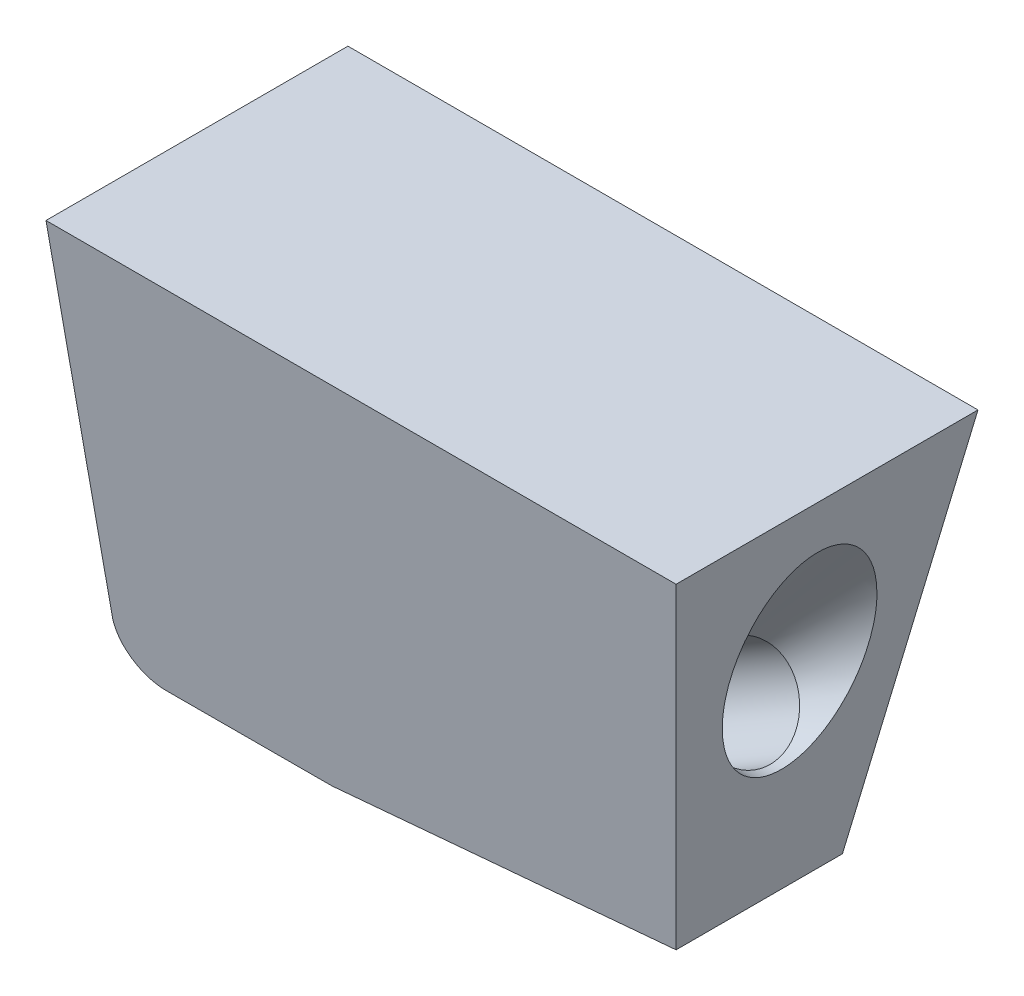
ISO-10303-21;
HEADER;
FILE_DESCRIPTION(('STEP AP214'),'2;1');
FILE_NAME('part.step','',(''),(''),'','','');
FILE_SCHEMA(('AUTOMOTIVE_DESIGN { 1 0 10303 214 1 1 1 1 }'));
ENDSEC;
DATA;
#1=APPLICATION_CONTEXT('core data for automotive mechanical design processes');
#2=APPLICATION_PROTOCOL_DEFINITION('international standard','automotive_design',2000,#1);
#3=PRODUCT_CONTEXT('',#1,'mechanical');
#4=PRODUCT('Part','Part','',(#3));
#5=PRODUCT_RELATED_PRODUCT_CATEGORY('part','',(#4));
#6=PRODUCT_DEFINITION_FORMATION('','',#4);
#7=PRODUCT_DEFINITION_CONTEXT('part definition',#1,'design');
#8=PRODUCT_DEFINITION('design','',#6,#7);
#9=PRODUCT_DEFINITION_SHAPE('','',#8);
#10=(LENGTH_UNIT() NAMED_UNIT(*) SI_UNIT(.MILLI.,.METRE.));
#11=(NAMED_UNIT(*) PLANE_ANGLE_UNIT() SI_UNIT($,.RADIAN.));
#12=(NAMED_UNIT(*) SI_UNIT($,.STERADIAN.) SOLID_ANGLE_UNIT());
#13=UNCERTAINTY_MEASURE_WITH_UNIT(LENGTH_MEASURE(1.E-05),#10,'distance_accuracy_value','');
#14=(GEOMETRIC_REPRESENTATION_CONTEXT(3) GLOBAL_UNCERTAINTY_ASSIGNED_CONTEXT((#13)) GLOBAL_UNIT_ASSIGNED_CONTEXT((#10,
#11,#12)) REPRESENTATION_CONTEXT('',''));
#15=CARTESIAN_POINT('',(0.,0.,0.));
#16=DIRECTION('',(0.,0.,1.));
#17=DIRECTION('',(1.,0.,0.));
#18=AXIS2_PLACEMENT_3D('',#15,#16,#17);
#19=CARTESIAN_POINT('',(38.0505893023531,0.,0.0508));
#20=DIRECTION('',(0.,-0.173648177666931,0.984807753012208));
#21=DIRECTION('',(0.,-0.984807753012208,-0.173648177666931));
#22=AXIS2_PLACEMENT_3D('',#19,#20,#21);
#23=PLANE('',#22);
#24=DIRECTION('',(-0.171087869746036,-0.970287525247814,-0.171087869746036));
#25=VECTOR('',#24,1.);
#26=CARTESIAN_POINT('',(1.10638409655466,6.31783117977007,1.16480409655466));
#27=LINE('',#26,#25);
#28=CARTESIAN_POINT('',(0.0416151661605582,0.279226502732242,0.100035166160561));
#29=VERTEX_POINT('',#28);
#30=CARTESIAN_POINT('',(-0.00330342407018095,0.0244805185938037,0.0551165759298227));
#31=VERTEX_POINT('',#30);
#32=EDGE_CURVE('E484',#29,#31,#27,.T.);
#33=ORIENTED_EDGE('',*,*,#32,.F.);
#34=DIRECTION('',(-1.,0.,0.));
#35=VECTOR('',#34,1.);
#36=CARTESIAN_POINT('',(38.0505893023531,0.27922650273224,0.10003516616056));
#37=LINE('',#36,#35);
#38=CARTESIAN_POINT('',(-0.37592,0.279226502732242,0.100035166160561));
#39=VERTEX_POINT('',#38);
#40=EDGE_CURVE('E76',#29,#39,#37,.T.);
#41=ORIENTED_EDGE('',*,*,#40,.T.);
#42=DIRECTION('',(0.,0.984807753012208,0.173648177666931));
#43=VECTOR('',#42,1.);
#44=CARTESIAN_POINT('',(-0.37592,28.949469786949,5.15537260064367));
#45=LINE('',#44,#43);
#46=CARTESIAN_POINT('',(-0.37592,0.0279933931874865,0.0557359905005352));
#47=VERTEX_POINT('',#46);
#48=EDGE_CURVE('E235',#47,#39,#45,.T.);
#49=ORIENTED_EDGE('',*,*,#48,.F.);
#50=CARTESIAN_POINT('',(-0.3455416,0.03048,0.0561744463719871));
#51=DIRECTION('',(0.,-0.173648177666931,0.984807753012208));
#52=DIRECTION('',(0.,-0.984807753012208,-0.173648177666931));
#53=AXIS2_PLACEMENT_3D('',#50,#51,#52);
#54=ELLIPSE('',#53,0.0309502031302775,0.03048);
#55=CARTESIAN_POINT('',(-0.345541599999999,0.,0.0508));
#56=VERTEX_POINT('',#55);
#57=EDGE_CURVE('E519',#56,#47,#54,.F.);
#58=ORIENTED_EDGE('',*,*,#57,.F.);
#59=DIRECTION('',(-1.,0.,0.));
#60=VECTOR('',#59,1.);
#61=CARTESIAN_POINT('',(38.0505893023531,0.,0.0508));
#62=LINE('',#61,#60);
#63=CARTESIAN_POINT('',(-0.235781197496023,4.61200016131661E-05,0.0506304480857589));
#64=VERTEX_POINT('',#63);
#65=EDGE_CURVE('E489',#64,#56,#62,.T.);
#66=ORIENTED_EDGE('',*,*,#65,.F.);
#67=DIRECTION('',(-0.994353014523129,-0.104510713175574,-0.0184280585059375));
#68=VECTOR('',#67,1.);
#69=CARTESIAN_POINT('',(37.6194000969927,3.97878600080242,0.752367322406603));
#70=LINE('',#69,#68);
#71=EDGE_CURVE('E492',#31,#64,#70,.T.);
#72=ORIENTED_EDGE('',*,*,#71,.F.);
#73=EDGE_LOOP('',(#33,#41,#49,#58,#66,#72));
#74=FACE_BOUND('',#73,.T.);
#75=ADVANCED_FACE('F47',(#74),#23,.T.);
#76=CARTESIAN_POINT('',(38.0505893023531,0.,-0.0508));
#77=DIRECTION('',(0.,-0.173648177666931,-0.984807753012208));
#78=DIRECTION('',(0.,0.984807753012208,-0.173648177666931));
#79=AXIS2_PLACEMENT_3D('',#76,#77,#78);
#80=PLANE('',#79);
#81=DIRECTION('',(0.,-0.984807753012208,0.173648177666931));
#82=VECTOR('',#81,1.);
#83=CARTESIAN_POINT('',(-0.37592,29.2239341047245,-5.20376806510924));
#84=LINE('',#83,#82);
#85=CARTESIAN_POINT('',(-0.37592,0.279226502732242,-0.10003516616056));
#86=VERTEX_POINT('',#85);
#87=CARTESIAN_POINT('',(-0.37592,0.0279933931874934,-0.0557359905005361));
#88=VERTEX_POINT('',#87);
#89=EDGE_CURVE('E55',#86,#88,#84,.T.);
#90=ORIENTED_EDGE('',*,*,#89,.F.);
#91=DIRECTION('',(1.,0.,0.));
#92=VECTOR('',#91,1.);
#93=CARTESIAN_POINT('',(38.0505893023531,0.27922650273224,-0.10003516616056));
#94=LINE('',#93,#92);
#95=CARTESIAN_POINT('',(0.0416151661605583,0.279226502732242,-0.100035166160562));
#96=VERTEX_POINT('',#95);
#97=EDGE_CURVE('E184',#86,#96,#94,.T.);
#98=ORIENTED_EDGE('',*,*,#97,.T.);
#99=DIRECTION('',(0.171087869746036,0.970287525247814,-0.171087869746036));
#100=VECTOR('',#99,1.);
#101=CARTESIAN_POINT('',(1.10638409655466,6.31783117977007,-1.16480409655466));
#102=LINE('',#101,#100);
#103=CARTESIAN_POINT('',(-0.00330342407018095,0.0244805185938037,-0.0551165759298227));
#104=VERTEX_POINT('',#103);
#105=EDGE_CURVE('E173',#104,#96,#102,.T.);
#106=ORIENTED_EDGE('',*,*,#105,.F.);
#107=DIRECTION('',(0.994353014523129,0.104510713175574,-0.0184280585059375));
#108=VECTOR('',#107,1.);
#109=CARTESIAN_POINT('',(37.6194000969927,3.97878600080242,-0.752367322406603));
#110=LINE('',#109,#108);
#111=CARTESIAN_POINT('',(-0.235926593045333,0.000106493973270587,-0.0503307727094258));
#112=VERTEX_POINT('',#111);
#113=EDGE_CURVE('E181',#112,#104,#110,.T.);
#114=ORIENTED_EDGE('',*,*,#113,.F.);
#115=DIRECTION('',(-1.,0.,0.));
#116=VECTOR('',#115,1.);
#117=CARTESIAN_POINT('',(38.0505893023531,0.,-0.0508));
#118=LINE('',#117,#116);
#119=CARTESIAN_POINT('',(-0.345541600000068,0.,-0.0508));
#120=VERTEX_POINT('',#119);
#121=EDGE_CURVE('E237',#112,#120,#118,.T.);
#122=ORIENTED_EDGE('',*,*,#121,.T.);
#123=CARTESIAN_POINT('',(-0.3455416,0.03048,-0.056174446371994));
#124=DIRECTION('',(0.,-0.173648177666931,-0.984807753012208));
#125=DIRECTION('',(0.,0.984807753012208,-0.173648177666931));
#126=AXIS2_PLACEMENT_3D('',#123,#124,#125);
#127=ELLIPSE('',#126,0.0309502031302775,0.03048);
#128=EDGE_CURVE('E195',#88,#120,#127,.F.);
#129=ORIENTED_EDGE('',*,*,#128,.F.);
#130=EDGE_LOOP('',(#90,#98,#106,#114,#122,#129));
#131=FACE_BOUND('',#130,.T.);
#132=ADVANCED_FACE('F185',(#131),#80,.T.);
#133=CARTESIAN_POINT('',(-0.37592,29.999999944,-0.80247998));
#134=DIRECTION('',(-1.,0.,0.));
#135=DIRECTION('',(0.,0.,1.));
#136=AXIS2_PLACEMENT_3D('',#133,#134,#135);
#137=PLANE('',#136);
#138=ORIENTED_EDGE('',*,*,#48,.T.);
#139=DIRECTION('',(0.,0.,-1.));
#140=VECTOR('',#139,1.);
#141=CARTESIAN_POINT('',(-0.37592,0.279226502732242,-0.80247998));
#142=LINE('',#141,#140);
#143=EDGE_CURVE('E68',#39,#86,#142,.T.);
#144=ORIENTED_EDGE('',*,*,#143,.T.);
#145=ORIENTED_EDGE('',*,*,#89,.T.);
#146=DIRECTION('',(0.,0.,-1.));
#147=VECTOR('',#146,1.);
#148=CARTESIAN_POINT('',(-0.37592,0.0279933931874922,37.629382152139));
#149=LINE('',#148,#147);
#150=CARTESIAN_POINT('',(-0.375920000000003,0.0279935003496126,-0.013598319186524));
#151=VERTEX_POINT('',#150);
#152=EDGE_CURVE('E516',#151,#88,#149,.T.);
#153=ORIENTED_EDGE('',*,*,#152,.F.);
#154=CARTESIAN_POINT('',(-0.37592,0.,0.0508000000000002));
#155=CARTESIAN_POINT('',(-0.37592,0.0156730679254453,0.0367453037282476));
#156=CARTESIAN_POINT('',(-0.37592,0.0304799999999994,0.0187327107269303));
#157=CARTESIAN_POINT('',(-0.37592,0.0304799999999994,-0.0187327107269307));
#158=CARTESIAN_POINT('',(-0.37592,0.0156730679254463,-0.0367453037282485));
#159=CARTESIAN_POINT('',(-0.37592,0.,-0.0508000000000001));
#160=(BOUNDED_CURVE() B_SPLINE_CURVE(3,(#154,#155,#156,#157,#158,#159),.UNSPECIFIED.,.F.,
.F.) B_SPLINE_CURVE_WITH_KNOTS((4,2,4),(1.37145902181257,1.5707963267949,1.77013363177722),
.UNSPECIFIED.) CURVE() GEOMETRIC_REPRESENTATION_ITEM() RATIONAL_B_SPLINE_CURVE((1.,1.,1.,1.,1.,1.)) REPRESENTATION_ITEM(''));
#161=CARTESIAN_POINT('',(-0.37592,0.0279934988995247,0.0137532935373555));
#162=VERTEX_POINT('',#161);
#163=EDGE_CURVE('E592',#151,#162,#160,.F.);
#164=ORIENTED_EDGE('',*,*,#163,.T.);
#165=EDGE_CURVE('E526',#47,#162,#149,.T.);
#166=ORIENTED_EDGE('',*,*,#165,.F.);
#167=EDGE_LOOP('',(#138,#144,#145,#153,#164,#166));
#168=FACE_BOUND('',#167,.T.);
#169=ADVANCED_FACE('F253',(#168),#137,.T.);
#170=CARTESIAN_POINT('',(-0.00330342407017718,0.0244805185938041,38.4527456938784));
#171=DIRECTION('',(-0.984807753012208,0.173648177666931,0.));
#172=DIRECTION('',(-0.173648177666931,-0.984807753012208,0.));
#173=AXIS2_PLACEMENT_3D('',#170,#171,#172);
#174=PLANE('',#173);
#175=CARTESIAN_POINT('',(0.0234414467148391,0.176158218044891,0.));
#176=DIRECTION('',(-0.984807753012208,0.173648177666931,0.));
#177=DIRECTION('',(0.173648177666931,0.984807753012208,0.));
#178=AXIS2_PLACEMENT_3D('',#175,#176,#177);
#179=ELLIPSE('',#178,0.0693607973593453,0.0498208670946964);
#180=CARTESIAN_POINT('',(0.0354858227778146,0.244465269039483,0.));
#181=VERTEX_POINT('',#180);
#182=EDGE_CURVE('E481',#181,#181,#179,.F.);
#183=ORIENTED_EDGE('',*,*,#182,.F.);
#184=EDGE_LOOP('',(#183));
#185=FACE_BOUND('',#184,.T.);
#186=DIRECTION('',(0.,0.,-1.));
#187=VECTOR('',#186,1.);
#188=CARTESIAN_POINT('',(0.0416151661605599,0.27922650273224,38.4527456938784));
#189=LINE('',#188,#187);
#190=EDGE_CURVE('E13',#29,#96,#189,.T.);
#191=ORIENTED_EDGE('',*,*,#190,.F.);
#192=ORIENTED_EDGE('',*,*,#32,.T.);
#193=DIRECTION('',(0.,0.,-1.));
#194=VECTOR('',#193,1.);
#195=CARTESIAN_POINT('',(-0.00330342407017718,0.0244805185938041,38.4527456938784));
#196=LINE('',#195,#194);
#197=EDGE_CURVE('E177',#31,#104,#196,.T.);
#198=ORIENTED_EDGE('',*,*,#197,.T.);
#199=ORIENTED_EDGE('',*,*,#105,.T.);
#200=EDGE_LOOP('',(#191,#192,#198,#199));
#201=FACE_BOUND('',#200,.T.);
#202=ADVANCED_FACE('F175',(#185,#201),#174,.F.);
#203=CARTESIAN_POINT('',(-0.23622,0.,38.4527456938784));
#204=DIRECTION('',(-0.104528463267654,0.994521895368273,0.));
#205=DIRECTION('',(-0.994521895368273,-0.104528463267654,0.));
#206=AXIS2_PLACEMENT_3D('',#203,#204,#205);
#207=PLANE('',#206);
#208=DIRECTION('',(0.,0.,1.));
#209=VECTOR('',#208,1.);
#210=CARTESIAN_POINT('',(-0.0863600000000001,0.0157509206969144,38.4527456938784));
#211=LINE('',#210,#209);
#212=CARTESIAN_POINT('',(-0.0863600000000001,0.0157509206969144,-0.0321798856351077));
#213=VERTEX_POINT('',#212);
#214=CARTESIAN_POINT('',(-0.0863600000000001,0.0157509206969144,0.0321798856351077));
#215=VERTEX_POINT('',#214);
#216=EDGE_CURVE('E487',#213,#215,#211,.T.);
#217=ORIENTED_EDGE('',*,*,#216,.F.);
#218=CARTESIAN_POINT('',(0.000562235499539099,0.0248868157866771,-0.05588));
#219=DIRECTION('',(-0.104528463267654,0.994521895368273,0.));
#220=DIRECTION('',(-0.994521895368273,-0.104528463267654,0.));
#221=AXIS2_PLACEMENT_3D('',#218,#219,#220);
#222=ELLIPSE('',#221,0.242996014731041,0.0254);
#223=CARTESIAN_POINT('',(-0.22475628991951,0.0012048844813173,-0.0466971973788338));
#224=VERTEX_POINT('',#223);
#225=EDGE_CURVE('E390',#213,#224,#222,.F.);
#226=ORIENTED_EDGE('',*,*,#225,.T.);
#227=CARTESIAN_POINT('',(-0.235579139677597,0.000149879776747642,-0.0501103443095576));
#228=CARTESIAN_POINT('',(-0.235442242843568,0.000164449721865781,-0.0500362278253878));
#229=CARTESIAN_POINT('',(-0.235303634042563,0.000178896417331246,-0.0499653707197149));
#230=CARTESIAN_POINT('',(-0.23501457630357,0.000208528666585915,-0.0498246979331132));
#231=CARTESIAN_POINT('',(-0.234863945213482,0.000223700871599157,-0.049755252346407));
#232=CARTESIAN_POINT('',(-0.234550959941598,0.000254827097770977,-0.0496171394033762));
#233=CARTESIAN_POINT('',(-0.23438846372075,0.000270770363653121,-0.0495487949423663));
#234=CARTESIAN_POINT('',(-0.234051778823581,0.000303483281930082,-0.0494126935650642));
#235=CARTESIAN_POINT('',(-0.233877475389863,0.000320244871045852,-0.0493452199657986));
#236=CARTESIAN_POINT('',(-0.233321908081644,0.000373304811864521,-0.0491375475376589));
#237=CARTESIAN_POINT('',(-0.232937809647185,0.000409447145453228,-0.0490049236406628));
#238=CARTESIAN_POINT('',(-0.232123965774192,0.000485702134312039,-0.0487380371087618));
#239=CARTESIAN_POINT('',(-0.231693780599334,0.000525820990713552,-0.0486051516536618));
#240=CARTESIAN_POINT('',(-0.23078813005989,0.000610543209536927,-0.048335581426661));
#241=CARTESIAN_POINT('',(-0.230312396770506,0.000655197457199921,-0.0481998221251929));
#242=CARTESIAN_POINT('',(-0.229316168220303,0.000749586020039313,-0.0479219989325999));
#243=CARTESIAN_POINT('',(-0.228795531257941,0.000799413415442067,-0.0477804820633569));
#244=CARTESIAN_POINT('',(-0.22771011010539,0.000904838852232286,-0.0474882549493961));
#245=CARTESIAN_POINT('',(-0.227145279443363,0.000960570747874984,-0.0473377670570265));
#246=CARTESIAN_POINT('',(-0.225972120920295,0.00107856928775602,-0.0470247172404809));
#247=CARTESIAN_POINT('',(-0.225363818599347,0.00114100744123704,-0.046862124483503));
#248=CARTESIAN_POINT('',(-0.224756289951526,0.00120488480595515,-0.04669719732717));
#249=B_SPLINE_CURVE_WITH_KNOTS('',3,(#227,#228,#229,#230,#231,#232,#233,#234,#235,#236,#237,
#238,#239,#240,#241,#242,#243,#244,#245,#246,#247,#248),.UNSPECIFIED.,.F.,.F.,(4,2,2,2,2,2,2,2,
2,2,4),(0.,0.000468932342508875,0.000968483603476189,0.00149941405281304,0.00206232239652544,
0.00328580330992426,0.00464174763413959,0.00613188179577876,0.00775733573479151,
0.00951888663884362,0.0114171198536434),.UNSPECIFIED.);
#250=EDGE_CURVE('E324',#224,#112,#249,.F.);
#251=ORIENTED_EDGE('',*,*,#250,.T.);
#252=ORIENTED_EDGE('',*,*,#113,.T.);
#253=ORIENTED_EDGE('',*,*,#197,.F.);
#254=ORIENTED_EDGE('',*,*,#71,.T.);
#255=CARTESIAN_POINT('',(-0.22475629000155,0.00120488466226605,0.0466971976977369));
#256=CARTESIAN_POINT('',(-0.22536778580854,0.00114058923760712,0.0468632308509888));
#257=CARTESIAN_POINT('',(-0.225980034081235,0.00107772899126656,0.0470270112545885));
#258=CARTESIAN_POINT('',(-0.227159656407866,0.000959035688907424,0.0473421881648843));
#259=CARTESIAN_POINT('',(-0.227727006878543,0.000903026426788786,0.0474936063945888));
#260=CARTESIAN_POINT('',(-0.228816349064596,0.000797167694177708,0.0477874567082213));
#261=CARTESIAN_POINT('',(-0.229338389826693,0.00074718075723197,0.0479296559032958));
#262=CARTESIAN_POINT('',(-0.230336563374155,0.000652569341651911,0.0482086148344451));
#263=CARTESIAN_POINT('',(-0.230812841158365,0.000607849145038361,0.0483448159151214));
#264=CARTESIAN_POINT('',(-0.231718932054331,0.000523069481481765,0.0486150397545883));
#265=CARTESIAN_POINT('',(-0.232149016792873,0.000482957306353264,0.0487481257875257));
#266=CARTESIAN_POINT('',(-0.232962188682516,0.000406770835993421,0.049015175957149));
#267=CARTESIAN_POINT('',(-0.233345719317321,0.000370689317815238,0.0491477530589651));
#268=CARTESIAN_POINT('',(-0.23390031988937,0.000317736629892091,0.0493552210156713));
#269=CARTESIAN_POINT('',(-0.234074212552547,0.000301019952483351,0.0494225739286011));
#270=CARTESIAN_POINT('',(-0.234410011978611,0.000268403908169871,0.0495583692224359));
#271=CARTESIAN_POINT('',(-0.234572033942403,0.000252512685077711,0.0496265273163897));
#272=CARTESIAN_POINT('',(-0.234884021269757,0.000221495673030605,0.0497642009183881));
#273=CARTESIAN_POINT('',(-0.235034129079707,0.000206380805492011,0.0498333926343054));
#274=CARTESIAN_POINT('',(-0.235322103762854,0.000176866165913026,0.0499734900809924));
#275=CARTESIAN_POINT('',(-0.235460153255019,0.000162480032879516,0.0500440246951365));
#276=CARTESIAN_POINT('',(-0.235596503938077,0.000147968805448963,0.050117795312154));
#277=B_SPLINE_CURVE_WITH_KNOTS('',3,(#255,#256,#257,#258,#259,#260,#261,#262,#263,#264,#265,
#266,#267,#268,#269,#270,#271,#272,#273,#274,#275,#276),.UNSPECIFIED.,.F.,.F.,(4,2,2,2,2,2,2,2,
2,2,4),(0.,0.00191065376572403,0.0036802707522462,0.00531034981747067,0.00680242870782612,
0.00815826260577981,0.00938008190930348,0.00994170411131559,0.0104710993990257,
0.0109688991040492,0.0114358896836988),.UNSPECIFIED.);
#278=CARTESIAN_POINT('',(-0.224756289981843,0.00120488447476593,0.0466971976977384));
#279=VERTEX_POINT('',#278);
#280=EDGE_CURVE('E302',#64,#279,#277,.F.);
#281=ORIENTED_EDGE('',*,*,#280,.T.);
#282=CARTESIAN_POINT('',(0.000562235499539099,0.0248868157866771,0.05588));
#283=DIRECTION('',(-0.104528463267654,0.994521895368273,0.));
#284=DIRECTION('',(-0.994521895368273,-0.104528463267654,0.));
#285=AXIS2_PLACEMENT_3D('',#282,#283,#284);
#286=ELLIPSE('',#285,0.242996014731041,0.0254);
#287=EDGE_CURVE('E499',#279,#215,#286,.F.);
#288=ORIENTED_EDGE('',*,*,#287,.T.);
#289=EDGE_LOOP('',(#217,#226,#251,#252,#253,#254,#281,#288));
#290=FACE_BOUND('',#289,.T.);
#291=ADVANCED_FACE('F371',(#290),#207,.F.);
#292=CARTESIAN_POINT('',(-0.0863600000000001,0.0914400000000001,0.03048));
#293=DIRECTION('',(-1.,0.,0.));
#294=DIRECTION('',(0.,0.,1.));
#295=AXIS2_PLACEMENT_3D('',#292,#293,#294);
#296=PLANE('',#295);
#297=ORIENTED_EDGE('',*,*,#216,.T.);
#298=CARTESIAN_POINT('',(-0.0863600000000006,0.0248868157866771,0.05588));
#299=DIRECTION('',(-1.,0.,0.));
#300=DIRECTION('',(0.,0.,1.));
#301=AXIS2_PLACEMENT_3D('',#298,#299,#300);
#302=CIRCLE('',#301,0.0254);
#303=CARTESIAN_POINT('',(-0.0863600000000001,0.0248868157866771,0.03048));
#304=VERTEX_POINT('',#303);
#305=EDGE_CURVE('E572',#215,#304,#302,.F.);
#306=ORIENTED_EDGE('',*,*,#305,.T.);
#307=DIRECTION('',(0.,1.,0.));
#308=VECTOR('',#307,1.);
#309=CARTESIAN_POINT('',(-0.0863600000000001,0.0914400000000001,0.03048));
#310=LINE('',#309,#308);
#311=CARTESIAN_POINT('',(-0.0863600000000001,0.0811747122138084,0.03048));
#312=VERTEX_POINT('',#311);
#313=EDGE_CURVE('E405',#304,#312,#310,.T.);
#314=ORIENTED_EDGE('',*,*,#313,.T.);
#315=CARTESIAN_POINT('',(-0.0863600000000001,0.0914400000000001,0.));
#316=DIRECTION('',(1.,0.,0.));
#317=DIRECTION('',(0.,1.,0.));
#318=AXIS2_PLACEMENT_3D('',#315,#316,#317);
#319=ELLIPSE('',#318,0.0366617420935412,0.03175);
#320=CARTESIAN_POINT('',(-0.0863600000000001,0.0811747122138084,-0.03048));
#321=VERTEX_POINT('',#320);
#322=EDGE_CURVE('E544',#321,#312,#319,.F.);
#323=ORIENTED_EDGE('',*,*,#322,.F.);
#324=DIRECTION('',(0.,1.,0.));
#325=VECTOR('',#324,1.);
#326=CARTESIAN_POINT('',(-0.0863600000000001,0.0914400000000001,-0.03048));
#327=LINE('',#326,#325);
#328=CARTESIAN_POINT('',(-0.0863600000000001,0.0248868157866771,-0.03048));
#329=VERTEX_POINT('',#328);
#330=EDGE_CURVE('E410',#329,#321,#327,.T.);
#331=ORIENTED_EDGE('',*,*,#330,.F.);
#332=CARTESIAN_POINT('',(-0.0863600000000006,0.0248868157866771,-0.05588));
#333=DIRECTION('',(-1.,0.,0.));
#334=DIRECTION('',(0.,0.,1.));
#335=AXIS2_PLACEMENT_3D('',#332,#333,#334);
#336=CIRCLE('',#335,0.0254);
#337=EDGE_CURVE('E573',#329,#213,#336,.F.);
#338=ORIENTED_EDGE('',*,*,#337,.T.);
#339=EDGE_LOOP('',(#297,#306,#314,#323,#331,#338));
#340=FACE_BOUND('',#339,.T.);
#341=ADVANCED_FACE('F375',(#340),#296,.T.);
#342=CARTESIAN_POINT('',(0.,0.,0.03048));
#343=DIRECTION('',(0.,0.,-1.));
#344=DIRECTION('',(-1.,0.,0.));
#345=AXIS2_PLACEMENT_3D('',#342,#343,#344);
#346=PLANE('',#345);
#347=ORIENTED_EDGE('',*,*,#313,.F.);
#348=DIRECTION('',(1.,0.,0.));
#349=VECTOR('',#348,1.);
#350=CARTESIAN_POINT('',(-0.237240907925242,0.0248868157866771,0.03048));
#351=LINE('',#350,#349);
#352=CARTESIAN_POINT('',(-0.224756290005691,0.0248868639217525,0.03048));
#353=VERTEX_POINT('',#352);
#354=EDGE_CURVE('E397',#304,#353,#351,.F.);
#355=ORIENTED_EDGE('',*,*,#354,.T.);
#356=DIRECTION('',(-0.500000000000004,-0.866025403784436,0.));
#357=VECTOR('',#356,1.);
#358=CARTESIAN_POINT('',(-0.179343545692649,0.103544044383074,0.03048));
#359=LINE('',#358,#357);
#360=CARTESIAN_POINT('',(-0.1863318189755,0.0914400000000001,0.03048));
#361=VERTEX_POINT('',#360);
#362=EDGE_CURVE('E400',#361,#353,#359,.T.);
#363=ORIENTED_EDGE('',*,*,#362,.F.);
#364=DIRECTION('',(-1.,0.,0.));
#365=VECTOR('',#364,1.);
#366=CARTESIAN_POINT('',(-0.2215270913853,0.0914400000000001,0.03048));
#367=LINE('',#366,#365);
#368=CARTESIAN_POINT('',(-0.104140000000001,0.0914400000000001,0.03048));
#369=VERTEX_POINT('',#368);
#370=EDGE_CURVE('E548',#369,#361,#367,.T.);
#371=ORIENTED_EDGE('',*,*,#370,.F.);
#372=CARTESIAN_POINT('',(-0.0863600000000001,0.0914400000000001,0.0304799999999994));
#373=VERTEX_POINT('',#372);
#374=EDGE_CURVE('E545',#373,#369,#367,.T.);
#375=ORIENTED_EDGE('',*,*,#374,.F.);
#376=EDGE_CURVE('E543',#312,#373,#310,.T.);
#377=ORIENTED_EDGE('',*,*,#376,.F.);
#378=EDGE_LOOP('',(#347,#355,#363,#371,#375,#377));
#379=FACE_BOUND('',#378,.T.);
#380=ADVANCED_FACE('F451',(#379),#346,.T.);
#381=CARTESIAN_POINT('',(0.,0.,-0.03048));
#382=DIRECTION('',(0.,0.,-1.));
#383=DIRECTION('',(-1.,0.,0.));
#384=AXIS2_PLACEMENT_3D('',#381,#382,#383);
#385=PLANE('',#384);
#386=DIRECTION('',(0.500000000000004,0.866025403784436,0.));
#387=VECTOR('',#386,1.);
#388=CARTESIAN_POINT('',(-0.1863318189755,0.0914400000000001,-0.03048));
#389=LINE('',#388,#387);
#390=CARTESIAN_POINT('',(-0.2247562899924,0.0248868639447728,-0.03048));
#391=VERTEX_POINT('',#390);
#392=CARTESIAN_POINT('',(-0.1863318189755,0.0914400000000001,-0.03048));
#393=VERTEX_POINT('',#392);
#394=EDGE_CURVE('E404',#391,#393,#389,.T.);
#395=ORIENTED_EDGE('',*,*,#394,.F.);
#396=DIRECTION('',(-1.,0.,0.));
#397=VECTOR('',#396,1.);
#398=CARTESIAN_POINT('',(0.,0.0248868157866771,-0.03048));
#399=LINE('',#398,#397);
#400=EDGE_CURVE('E419',#391,#329,#399,.F.);
#401=ORIENTED_EDGE('',*,*,#400,.T.);
#402=ORIENTED_EDGE('',*,*,#330,.T.);
#403=CARTESIAN_POINT('',(-0.0863600000000001,0.0914400000000001,-0.0304799999999994));
#404=VERTEX_POINT('',#403);
#405=EDGE_CURVE('E550',#321,#404,#327,.T.);
#406=ORIENTED_EDGE('',*,*,#405,.T.);
#407=DIRECTION('',(-1.,0.,0.));
#408=VECTOR('',#407,1.);
#409=CARTESIAN_POINT('',(-0.2215270913853,0.0914400000000001,-0.03048));
#410=LINE('',#409,#408);
#411=CARTESIAN_POINT('',(-0.104140000000001,0.0914400000000001,-0.03048));
#412=VERTEX_POINT('',#411);
#413=EDGE_CURVE('E549',#404,#412,#410,.T.);
#414=ORIENTED_EDGE('',*,*,#413,.T.);
#415=EDGE_CURVE('E551',#412,#393,#410,.T.);
#416=ORIENTED_EDGE('',*,*,#415,.T.);
#417=EDGE_LOOP('',(#395,#401,#402,#406,#414,#416));
#418=FACE_BOUND('',#417,.T.);
#419=ADVANCED_FACE('F453',(#418),#385,.F.);
#420=CARTESIAN_POINT('',(-0.0120327391918048,0.134352864035739,0.));
#421=DIRECTION('',(0.866025403784441,0.499999999999995,0.));
#422=DIRECTION('',(-0.499999999999995,0.866025403784441,0.));
#423=AXIS2_PLACEMENT_3D('',#420,#421,#422);
#424=CONICAL_SURFACE('',#423,0.03175,0.392699081698725);
#425=CARTESIAN_POINT('',(-0.0120327391918048,0.134352864035739,0.));
#426=DIRECTION('',(0.866025403784441,0.499999999999995,0.));
#427=DIRECTION('',(-0.499999999999995,0.866025403784441,0.));
#428=AXIS2_PLACEMENT_3D('',#425,#426,#427);
#429=CIRCLE('',#428,0.03175);
#430=CARTESIAN_POINT('',(-0.0279077391918047,0.161849170605895,0.));
#431=VERTEX_POINT('',#430);
#432=EDGE_CURVE('E478',#431,#431,#429,.T.);
#433=ORIENTED_EDGE('',*,*,#432,.F.);
#434=EDGE_LOOP('',(#433));
#435=FACE_BOUND('',#434,.T.);
#436=ORIENTED_EDGE('',*,*,#182,.T.);
#437=EDGE_LOOP('',(#436));
#438=FACE_BOUND('',#437,.T.);
#439=ADVANCED_FACE('F444',(#435,#438),#424,.F.);
#440=CARTESIAN_POINT('',(-0.1863318189755,0.0914400000000001,0.));
#441=DIRECTION('',(-0.500000000000004,-0.866025403784436,0.));
#442=DIRECTION('',(0.866025403784436,-0.500000000000004,0.));
#443=AXIS2_PLACEMENT_3D('',#440,#441,#442);
#444=CYLINDRICAL_SURFACE('',#443,0.03048);
#445=ORIENTED_EDGE('',*,*,#362,.T.);
#446=CARTESIAN_POINT('',(-0.224756289968201,0.0248868639308014,-0.0304800000192568));
#447=CARTESIAN_POINT('',(-0.235059435187014,0.0218102166008076,-0.0304800000260265));
#448=CARTESIAN_POINT('',(-0.244764393794915,0.0198457012540554,-0.0277935186524455));
#449=CARTESIAN_POINT('',(-0.25935344008006,0.017887198494452,-0.0170727391432367));
#450=CARTESIAN_POINT('',(-0.264067525214817,0.0177792949730064,-0.0086189260136722));
#451=CARTESIAN_POINT('',(-0.264041843312514,0.0177807075404811,0.0086947485230125));
#452=CARTESIAN_POINT('',(-0.259300916242362,0.0178934933108031,0.0171178628147559));
#453=CARTESIAN_POINT('',(-0.244784437597167,0.0198437680297915,0.0277722485265015));
#454=CARTESIAN_POINT('',(-0.235210110644977,0.0217650953490288,0.0304800000199523));
#455=CARTESIAN_POINT('',(-0.22475629000324,0.0248868639203377,0.0304800000192567));
#456=(BOUNDED_CURVE() B_SPLINE_CURVE(3,(#446,#447,#448,#449,#450,#451,#452,#453,#454,#455),
.UNSPECIFIED.,.F.,.F.) B_SPLINE_CURVE_WITH_KNOTS((4,2,2,2,4),(-7.81517298382024E-06,
2.14240623682599E-05,5.06632977203399E-05,7.990253307242E-05,0.0001091417684245),
.UNSPECIFIED.) CURVE() GEOMETRIC_REPRESENTATION_ITEM() RATIONAL_B_SPLINE_CURVE((1.,1.,1.,1.,1.,
1.,1.,1.,1.,1.)) REPRESENTATION_ITEM(''));
#457=EDGE_CURVE('E421',#353,#391,#456,.F.);
#458=ORIENTED_EDGE('',*,*,#457,.T.);
#459=ORIENTED_EDGE('',*,*,#394,.T.);
#460=CARTESIAN_POINT('',(-0.1863318189755,0.0914400000000001,0.));
#461=DIRECTION('',(0.,-1.,0.));
#462=DIRECTION('',(-1.,0.,0.));
#463=AXIS2_PLACEMENT_3D('',#460,#461,#462);
#464=ELLIPSE('',#463,0.0351952724097997,0.03048);
#465=EDGE_CURVE('E414',#393,#361,#464,.F.);
#466=ORIENTED_EDGE('',*,*,#465,.T.);
#467=EDGE_LOOP('',(#445,#458,#459,#466));
#468=FACE_BOUND('',#467,.T.);
#469=ADVANCED_FACE('F432',(#468),#444,.F.);
#470=CARTESIAN_POINT('',(-0.2215270913853,0.0914400000000001,0.03048));
#471=DIRECTION('',(0.,-1.,0.));
#472=DIRECTION('',(0.,0.,-1.));
#473=AXIS2_PLACEMENT_3D('',#470,#471,#472);
#474=PLANE('',#473);
#475=ORIENTED_EDGE('',*,*,#415,.F.);
#476=CARTESIAN_POINT('',(-0.0863600000000002,0.0914400000000001,0.));
#477=DIRECTION('',(0.,1.,0.));
#478=DIRECTION('',(1.,0.,0.));
#479=AXIS2_PLACEMENT_3D('',#476,#477,#478);
#480=ELLIPSE('',#479,0.0635000000000007,0.03175);
#481=EDGE_CURVE('E539',#369,#412,#480,.F.);
#482=ORIENTED_EDGE('',*,*,#481,.F.);
#483=ORIENTED_EDGE('',*,*,#370,.T.);
#484=ORIENTED_EDGE('',*,*,#465,.F.);
#485=EDGE_LOOP('',(#475,#482,#483,#484));
#486=FACE_BOUND('',#485,.T.);
#487=ADVANCED_FACE('F443',(#486),#474,.T.);
#488=CARTESIAN_POINT('',(-0.0863600000000001,0.0914400000000001,37.6441893023531));
#489=DIRECTION('',(1.,0.,0.));
#490=DIRECTION('',(0.,0.,-1.));
#491=AXIS2_PLACEMENT_3D('',#488,#489,#490);
#492=PLANE('',#491);
#493=CARTESIAN_POINT('',(-0.0863600000000001,0.0914400000000001,-0.0317499999999971));
#494=VERTEX_POINT('',#493);
#495=EDGE_CURVE('E540',#494,#321,#319,.F.);
#496=ORIENTED_EDGE('',*,*,#495,.F.);
#497=DIRECTION('',(0.,0.,-1.));
#498=VECTOR('',#497,1.);
#499=CARTESIAN_POINT('',(-0.0863600000000001,0.0914400000000001,37.6441893023531));
#500=LINE('',#499,#498);
#501=EDGE_CURVE('E532',#404,#494,#500,.T.);
#502=ORIENTED_EDGE('',*,*,#501,.F.);
#503=ORIENTED_EDGE('',*,*,#405,.F.);
#504=EDGE_LOOP('',(#496,#502,#503));
#505=FACE_BOUND('',#504,.T.);
#506=ADVANCED_FACE('F447',(#505),#492,.T.);
#507=CARTESIAN_POINT('',(-0.2215270913853,0.0914400000000001,37.6441893023531));
#508=DIRECTION('',(0.,1.,0.));
#509=DIRECTION('',(0.,0.,1.));
#510=AXIS2_PLACEMENT_3D('',#507,#508,#509);
#511=PLANE('',#510);
#512=ORIENTED_EDGE('',*,*,#501,.T.);
#513=EDGE_CURVE('E534',#412,#494,#480,.F.);
#514=ORIENTED_EDGE('',*,*,#513,.F.);
#515=ORIENTED_EDGE('',*,*,#413,.F.);
#516=EDGE_LOOP('',(#512,#514,#515));
#517=FACE_BOUND('',#516,.T.);
#518=ADVANCED_FACE('F464',(#517),#511,.T.);
#519=CARTESIAN_POINT('',(-0.361395674844151,-0.0673519209080185,0.));
#520=DIRECTION('',(0.866025403784441,0.499999999999995,0.));
#521=DIRECTION('',(-0.499999999999995,0.866025403784441,0.));
#522=AXIS2_PLACEMENT_3D('',#519,#520,#521);
#523=CYLINDRICAL_SURFACE('',#522,0.03175);
#524=ORIENTED_EDGE('',*,*,#495,.T.);
#525=ORIENTED_EDGE('',*,*,#322,.T.);
#526=CARTESIAN_POINT('',(-0.0863600000000001,0.0914400000000001,0.0317499999999971));
#527=VERTEX_POINT('',#526);
#528=EDGE_CURVE('E538',#312,#527,#319,.F.);
#529=ORIENTED_EDGE('',*,*,#528,.T.);
#530=EDGE_CURVE('E535',#527,#369,#480,.F.);
#531=ORIENTED_EDGE('',*,*,#530,.T.);
#532=ORIENTED_EDGE('',*,*,#481,.T.);
#533=ORIENTED_EDGE('',*,*,#513,.T.);
#534=EDGE_LOOP('',(#524,#525,#529,#531,#532,#533));
#535=FACE_BOUND('',#534,.T.);
#536=ORIENTED_EDGE('',*,*,#432,.T.);
#537=EDGE_LOOP('',(#536));
#538=FACE_BOUND('',#537,.T.);
#539=ADVANCED_FACE('F460',(#535,#538),#523,.F.);
#540=ORIENTED_EDGE('',*,*,#376,.T.);
#541=EDGE_CURVE('E529',#527,#373,#500,.T.);
#542=ORIENTED_EDGE('',*,*,#541,.F.);
#543=ORIENTED_EDGE('',*,*,#528,.F.);
#544=EDGE_LOOP('',(#540,#542,#543));
#545=FACE_BOUND('',#544,.T.);
#546=ADVANCED_FACE('F463',(#545),#492,.T.);
#547=ORIENTED_EDGE('',*,*,#374,.T.);
#548=ORIENTED_EDGE('',*,*,#530,.F.);
#549=ORIENTED_EDGE('',*,*,#541,.T.);
#550=EDGE_LOOP('',(#547,#548,#549));
#551=FACE_BOUND('',#550,.T.);
#552=ADVANCED_FACE('F363',(#551),#511,.T.);
#553=CARTESIAN_POINT('',(37.8759643023531,-0.25146,0.));
#554=DIRECTION('',(-1.,0.,0.));
#555=DIRECTION('',(0.,0.,1.));
#556=AXIS2_PLACEMENT_3D('',#553,#554,#555);
#557=CYLINDRICAL_SURFACE('',#556,0.25654);
#558=ORIENTED_EDGE('',*,*,#65,.T.);
#559=CARTESIAN_POINT('',(-0.3455416,0.,0.0508000000000002));
#560=CARTESIAN_POINT('',(-0.34590880502967,-2.12915108240628E-07,0.0508009476401382));
#561=CARTESIAN_POINT('',(-0.346274734600404,6.62747054073759E-06,0.0507671986301757));
#562=CARTESIAN_POINT('',(-0.346991130660118,3.24592553658758E-05,0.0506391297992096));
#563=CARTESIAN_POINT('',(-0.347341728454045,5.13066935216942E-05,0.0505455275519271));
#564=CARTESIAN_POINT('',(-0.348115454963276,0.000105740348437402,0.050273972309946));
#565=CARTESIAN_POINT('',(-0.348532674369627,0.000144468341506695,0.0500800873606681));
#566=CARTESIAN_POINT('',(-0.34933142215873,0.000233842569470656,0.0496289727103923));
#567=CARTESIAN_POINT('',(-0.349712756434647,0.000284548934957599,0.0493714231042074));
#568=CARTESIAN_POINT('',(-0.350675130006044,0.000429262053233126,0.048629098904423));
#569=CARTESIAN_POINT('',(-0.351224821671271,0.000529987396606246,0.0481054581032416));
#570=CARTESIAN_POINT('',(-0.352241809881905,0.000741050099293871,0.0469865193107831));
#571=CARTESIAN_POINT('',(-0.352708915987217,0.000851408820391012,0.0463910608902733));
#572=CARTESIAN_POINT('',(-0.354069804722473,0.00120147878222137,0.0444601476142098));
#573=CARTESIAN_POINT('',(-0.354850849327591,0.00144673996429385,0.0430473311053798));
#574=CARTESIAN_POINT('',(-0.356226656304028,0.00192550654570127,0.0401346854275231));
#575=CARTESIAN_POINT('',(-0.356820906698063,0.00215897818835242,0.038634630240194));
#576=CARTESIAN_POINT('',(-0.359008589683147,0.00307419378381706,0.0323701665382016));
#577=CARTESIAN_POINT('',(-0.360059247423789,0.00366043536230611,0.0274073202954343));
#578=CARTESIAN_POINT('',(-0.361567596765754,0.00454349495255355,0.0173522990888003));
#579=CARTESIAN_POINT('',(-0.362020071414984,0.00483776108554197,0.0122593761120563));
#580=CARTESIAN_POINT('',(-0.36255133697745,0.00518400785836848,-0.000148329276623392));
#581=CARTESIAN_POINT('',(-0.362385812167177,0.00507741595866606,-0.00747691704568903));
#582=CARTESIAN_POINT('',(-0.361082308083919,0.00423645513316805,-0.0219778978026134));
#583=CARTESIAN_POINT('',(-0.359956891979805,0.00351019643402509,-0.0291510864565316));
#584=CARTESIAN_POINT('',(-0.357420372224461,0.00240860515023295,-0.0369398269914221));
#585=CARTESIAN_POINT('',(-0.357075988498909,0.0022640431297751,-0.0379190243449676));
#586=CARTESIAN_POINT('',(-0.356322366909514,0.0019671668327073,-0.0398545995774338));
#587=CARTESIAN_POINT('',(-0.355912947262668,0.00181483166435917,-0.0408109045820218));
#588=CARTESIAN_POINT('',(-0.354953240480043,0.00148444489414716,-0.0428141423039952));
#589=CARTESIAN_POINT('',(-0.354391325706282,0.00130573676845407,-0.0438554625950822));
#590=CARTESIAN_POINT('',(-0.353127059218524,0.000951567739061216,-0.0458494855080142));
#591=CARTESIAN_POINT('',(-0.352425414223275,0.00077609516284797,-0.0468026000854063));
#592=CARTESIAN_POINT('',(-0.351295540618728,0.000546223276285213,-0.0480184218098324));
#593=CARTESIAN_POINT('',(-0.350950922285728,0.00048157879928655,-0.0483561544125892));
#594=CARTESIAN_POINT('',(-0.350222133267038,0.0003592360821598,-0.0489892501559138));
#595=CARTESIAN_POINT('',(-0.34983791799938,0.000301545833803054,-0.0492845646229734));
#596=CARTESIAN_POINT('',(-0.349020924566574,0.000196391177866999,-0.0498187509400379));
#597=CARTESIAN_POINT('',(-0.348587470462423,0.000149104252027755,-0.0500566490225509));
#598=CARTESIAN_POINT('',(-0.347681733013308,7.18884403102625E-05,-0.0504432410582402));
#599=CARTESIAN_POINT('',(-0.347209673586203,4.18665805027259E-05,-0.0505924129617835));
#600=CARTESIAN_POINT('',(-0.346532139014814,1.54668092226804E-05,-0.0507233917925619));
#601=CARTESIAN_POINT('',(-0.346335537499706,9.70189230888666E-06,-0.0507519573510935));
#602=CARTESIAN_POINT('',(-0.34593988179654,1.95757443199028E-06,-0.0507903112606433));
#603=CARTESIAN_POINT('',(-0.345740822232396,-1.10400146872274E-08,-0.0508000461077944));
#604=CARTESIAN_POINT('',(-0.345541600000067,0.,-0.0508000000003431));
#605=B_SPLINE_CURVE_WITH_KNOTS('',3,(#559,#560,#561,#562,#563,#564,#565,#566,#567,#568,#569,
#570,#571,#572,#573,#574,#575,#576,#577,#578,#579,#580,#581,#582,#583,#584,#585,#586,#587,#588,
#589,#590,#591,#592,#593,#594,#595,#596,#597,#598,#599,#600,#601,#602,#603,#604),.UNSPECIFIED.,
.F.,.F.,(4,2,2,2,2,2,2,2,2,2,2,2,2,2,2,2,2,2,2,2,2,2,4),(0.,0.00109794135840951,
0.00218296030617324,0.00356032090571712,0.00494474846651632,0.00722925107990672,
0.00951895487079939,0.0143903152169212,0.0192749131639299,0.0344834314003673,0.0498237318149754,
0.0717597410815981,0.0934129788263682,0.0965551500353532,0.0997062637404752,0.103290538461796,
0.106857125341062,0.108315037814184,0.109774610056868,0.11125742655064,0.112732181313288,
0.113327609850536,0.113924727713411),.UNSPECIFIED.);
#606=CARTESIAN_POINT('',(-0.359811444520029,0.00356157148160334,0.0278630388874602));
#607=VERTEX_POINT('',#606);
#608=EDGE_CURVE('E517',#56,#607,#605,.T.);
#609=ORIENTED_EDGE('',*,*,#608,.T.);
#610=CARTESIAN_POINT('',(-0.37592,0.,-0.0508000000000001));
#611=CARTESIAN_POINT('',(-0.36321787660522,0.00337516606040568,-0.034092928000992));
#612=CARTESIAN_POINT('',(-0.35052,0.00508000000000001,-0.0170459542388484));
#613=CARTESIAN_POINT('',(-0.35052,0.00508000000000004,0.017045954238848));
#614=CARTESIAN_POINT('',(-0.36321787660522,0.00337516606040563,0.0340929280009924));
#615=CARTESIAN_POINT('',(-0.37592,0.,0.0508000000000002));
#616=(BOUNDED_CURVE() B_SPLINE_CURVE(3,(#610,#611,#612,#613,#614,#615),.UNSPECIFIED.,.F.,
.F.) B_SPLINE_CURVE_WITH_KNOTS((4,2,4),(1.37145902181257,1.5707963267949,1.77013363177722),
.UNSPECIFIED.) CURVE() GEOMETRIC_REPRESENTATION_ITEM() RATIONAL_B_SPLINE_CURVE((1.,1.,1.,1.,1.,1.)) REPRESENTATION_ITEM(''));
#617=CARTESIAN_POINT('',(-0.359811408312565,0.00356156814509107,-0.0278630694714922));
#618=VERTEX_POINT('',#617);
#619=EDGE_CURVE('E575',#607,#618,#616,.F.);
#620=ORIENTED_EDGE('',*,*,#619,.T.);
#621=EDGE_CURVE('E191',#618,#120,#605,.T.);
#622=ORIENTED_EDGE('',*,*,#621,.T.);
#623=ORIENTED_EDGE('',*,*,#121,.F.);
#624=CARTESIAN_POINT('',(-0.224756290001196,-9.24994741565588E-06,0.050845765783291));
#625=CARTESIAN_POINT('',(-0.240589095436101,-9.2245007086744E-06,0.0508456399400919));
#626=CARTESIAN_POINT('',(-0.255483009531128,0.00102178025392088,0.0463295562604071));
#627=CARTESIAN_POINT('',(-0.278367042216272,0.003644108815406,0.0285546985445997));
#628=CARTESIAN_POINT('',(-0.286030725707276,0.00507643218849203,0.0145043022450031));
#629=CARTESIAN_POINT('',(-0.286072699301604,0.00508355222097765,-0.014377817548491));
#630=CARTESIAN_POINT('',(-0.278450232743342,0.00365447837274478,-0.0284795501855076));
#631=CARTESIAN_POINT('',(-0.255451025207683,0.00101727958470032,-0.0463649128940728));
#632=CARTESIAN_POINT('',(-0.240355124924149,-9.08650845020983E-06,-0.0508449575183459));
#633=CARTESIAN_POINT('',(-0.224756289948037,-9.24994741565926E-06,-0.050845765783291));
#634=(BOUNDED_CURVE() B_SPLINE_CURVE(3,(#624,#625,#626,#627,#628,#629,#630,#631,#632,#633),
.UNSPECIFIED.,.F.,.F.) B_SPLINE_CURVE_WITH_KNOTS((4,2,2,2,4),(-7.81517298382024E-06,
2.14240623682599E-05,5.06632977203399E-05,7.990253307242E-05,0.0001091417684245),
.UNSPECIFIED.) CURVE() GEOMETRIC_REPRESENTATION_ITEM() RATIONAL_B_SPLINE_CURVE((1.,1.,1.,1.,1.,
1.,1.,1.,1.,1.)) REPRESENTATION_ITEM(''));
#635=EDGE_CURVE('E313',#112,#64,#634,.F.);
#636=ORIENTED_EDGE('',*,*,#635,.T.);
#637=EDGE_LOOP('',(#558,#609,#620,#622,#623,#636));
#638=FACE_BOUND('',#637,.T.);
#639=ADVANCED_FACE('F206',(#638),#557,.F.);
#640=CARTESIAN_POINT('',(37.8759643023531,0.0248868157866771,-0.05588));
#641=DIRECTION('',(-1.,0.,0.));
#642=DIRECTION('',(0.,0.,1.));
#643=AXIS2_PLACEMENT_3D('',#640,#641,#642);
#644=CYLINDRICAL_SURFACE('',#643,0.0254);
#645=ORIENTED_EDGE('',*,*,#337,.F.);
#646=ORIENTED_EDGE('',*,*,#400,.F.);
#647=CARTESIAN_POINT('',(-0.224756289948037,-9.24994741565926E-06,-0.050845765783291));
#648=CARTESIAN_POINT('',(-0.224756289964867,0.00410890422911064,-0.0304800000097326));
#649=CARTESIAN_POINT('',(-0.224756289968201,0.0248868639308014,-0.0304800000192568));
#650=(BOUNDED_CURVE() B_SPLINE_CURVE(2,(#647,#648,#649),.UNSPECIFIED.,.F.,
.F.) B_SPLINE_CURVE_WITH_KNOTS((3,3),(0.,1.),
.UNSPECIFIED.) CURVE() GEOMETRIC_REPRESENTATION_ITEM() RATIONAL_B_SPLINE_CURVE((1.,
0.774014921631709,1.)) REPRESENTATION_ITEM(''));
#651=EDGE_CURVE('E335',#224,#391,#650,.T.);
#652=ORIENTED_EDGE('',*,*,#651,.F.);
#653=ORIENTED_EDGE('',*,*,#225,.F.);
#654=EDGE_LOOP('',(#645,#646,#652,#653));
#655=FACE_BOUND('',#654,.T.);
#656=ADVANCED_FACE('F351',(#655),#644,.T.);
#657=CARTESIAN_POINT('',(-0.22475629000324,0.0248868639203377,0.0304800000192567));
#658=CARTESIAN_POINT('',(-0.235210110644977,0.0217650953490288,0.0304800000199523));
#659=CARTESIAN_POINT('',(-0.244784437597167,0.0198437680297915,0.0277722485265015));
#660=CARTESIAN_POINT('',(-0.259300916242362,0.0178934933108031,0.0171178628147559));
#661=CARTESIAN_POINT('',(-0.264041843312514,0.0177807075404811,0.0086947485230125));
#662=CARTESIAN_POINT('',(-0.264067525214817,0.0177792949730064,-0.0086189260136722));
#663=CARTESIAN_POINT('',(-0.25935344008006,0.017887198494452,-0.0170727391432367));
#664=CARTESIAN_POINT('',(-0.244764393794915,0.0198457012540554,-0.0277935186524455));
#665=CARTESIAN_POINT('',(-0.235059435187014,0.0218102166008076,-0.0304800000260265));
#666=CARTESIAN_POINT('',(-0.224756289968201,0.0248868639308014,-0.0304800000192568));
#667=CARTESIAN_POINT('',(-0.224756290002901,0.00410890422737978,0.0304800000182922));
#668=CARTESIAN_POINT('',(-0.235601094897617,0.00361523903119442,0.0329198383161759));
#669=CARTESIAN_POINT('',(-0.247604431946447,0.00367052285480298,0.0312927381623277));
#670=CARTESIAN_POINT('',(-0.265330827561347,0.00447440342767467,0.0200989247190647));
#671=CARTESIAN_POINT('',(-0.271370898050441,0.00507854265357698,0.0101525257989676));
#672=CARTESIAN_POINT('',(-0.271403153627744,0.00508145106796133,-0.0100636901295802));
#673=CARTESIAN_POINT('',(-0.265394019065998,0.00447777942147795,-0.0200511111891165));
#674=CARTESIAN_POINT('',(-0.247578297211257,0.00366881341796634,-0.0313173868163048));
#675=CARTESIAN_POINT('',(-0.235447480477808,0.00362230684532554,-0.0328846480675706));
#676=CARTESIAN_POINT('',(-0.224756289964867,0.00410890422911064,-0.0304800000097326));
#677=CARTESIAN_POINT('',(-0.224756290001196,-9.24994741565588E-06,0.050845765783291));
#678=CARTESIAN_POINT('',(-0.240589095436101,-9.2245007086744E-06,0.0508456399400919));
#679=CARTESIAN_POINT('',(-0.255483009531128,0.00102178025392088,0.0463295562604071));
#680=CARTESIAN_POINT('',(-0.278367042216272,0.003644108815406,0.0285546985445997));
#681=CARTESIAN_POINT('',(-0.286030725707276,0.00507643218849203,0.0145043022450031));
#682=CARTESIAN_POINT('',(-0.286072699301604,0.00508355222097765,-0.014377817548491));
#683=CARTESIAN_POINT('',(-0.278450232743342,0.00365447837274478,-0.0284795501855076));
#684=CARTESIAN_POINT('',(-0.255451025207683,0.00101727958470032,-0.0463649128940728));
#685=CARTESIAN_POINT('',(-0.240355124924149,-9.08650845020983E-06,-0.0508449575183459));
#686=CARTESIAN_POINT('',(-0.224756289948037,-9.24994741565926E-06,-0.050845765783291));
#687=(BOUNDED_SURFACE() B_SPLINE_SURFACE(2,3,((#657,#658,#659,#660,#661,#662,#663,#664,#665,
#666),(#667,#668,#669,#670,#671,#672,#673,#674,#675,#676),(#677,#678,#679,#680,#681,#682,#683,
#684,#685,#686)),.UNSPECIFIED.,.F.,.F.,.F.) B_SPLINE_SURFACE_WITH_KNOTS((3,3),(4,2,2,2,4),(0.,
1.),(-7.81517298382024E-06,2.14240623682599E-05,5.06632977203399E-05,7.990253307242E-05,
0.0001091417684245),
.UNSPECIFIED.) GEOMETRIC_REPRESENTATION_ITEM() RATIONAL_B_SPLINE_SURFACE(((1.,1.,1.,1.,1.,1.,1.,
1.,1.,1.),(0.774014921762128,0.813016156670953,0.835961558761008,0.862351845428951,
0.866012517108699,0.866038235419307,0.862439562213251,0.835932857666926,0.812542284946049,
0.774014921631709),(1.,1.,1.,1.,1.,1.,1.,1.,1.,1.))) REPRESENTATION_ITEM('') SURFACE());
#688=CARTESIAN_POINT('',(-0.224756313641555,0.0248868568613556,0.0304800000192521));
#689=CARTESIAN_POINT('',(-0.224756315760957,0.00410890305485117,0.0304800058132703));
#690=CARTESIAN_POINT('',(-0.224756325802542,-9.24994735635828E-06,0.0508457657829988));
#691=(BOUNDED_CURVE() B_SPLINE_CURVE(2,(#688,#689,#690),.UNSPECIFIED.,.F.,
.F.) B_SPLINE_CURVE_WITH_KNOTS((3,3),(0.,1.),
.UNSPECIFIED.) CURVE() GEOMETRIC_REPRESENTATION_ITEM() RATIONAL_B_SPLINE_CURVE((1.,
0.774015009952205,1.)) REPRESENTATION_ITEM(''));
#692=EDGE_CURVE('E290',#279,#353,#691,.F.);
#693=ORIENTED_EDGE('',*,*,#651,.T.);
#694=ORIENTED_EDGE('',*,*,#457,.F.);
#695=ORIENTED_EDGE('',*,*,#692,.F.);
#696=ORIENTED_EDGE('',*,*,#280,.F.);
#697=ORIENTED_EDGE('',*,*,#635,.F.);
#698=ORIENTED_EDGE('',*,*,#250,.F.);
#699=EDGE_LOOP('',(#693,#694,#695,#696,#697,#698));
#700=FACE_BOUND('',#699,.T.);
#701=ADVANCED_FACE('F268',(#700),#687,.T.);
#702=CARTESIAN_POINT('',(37.8759643023531,0.0248868157866771,0.05588));
#703=DIRECTION('',(-1.,0.,0.));
#704=DIRECTION('',(0.,0.,1.));
#705=AXIS2_PLACEMENT_3D('',#702,#703,#704);
#706=CYLINDRICAL_SURFACE('',#705,0.0254);
#707=ORIENTED_EDGE('',*,*,#692,.T.);
#708=ORIENTED_EDGE('',*,*,#354,.F.);
#709=ORIENTED_EDGE('',*,*,#305,.F.);
#710=ORIENTED_EDGE('',*,*,#287,.F.);
#711=EDGE_LOOP('',(#707,#708,#709,#710));
#712=FACE_BOUND('',#711,.T.);
#713=ADVANCED_FACE('F264',(#712),#706,.T.);
#714=CARTESIAN_POINT('',(-0.37592,0.,0.0508000000000002));
#715=CARTESIAN_POINT('',(-0.36321787660522,0.00337516606040563,0.0340929280009924));
#716=CARTESIAN_POINT('',(-0.35052,0.00508000000000004,0.017045954238848));
#717=CARTESIAN_POINT('',(-0.35052,0.00508000000000001,-0.0170459542388484));
#718=CARTESIAN_POINT('',(-0.36321787660522,0.00337516606040568,-0.034092928000992));
#719=CARTESIAN_POINT('',(-0.37592,0.,-0.0508000000000001));
#720=CARTESIAN_POINT('',(-0.37592,0.,0.0508000000000002));
#721=CARTESIAN_POINT('',(-0.375919999999957,0.00337547916256322,0.0340913768704157));
#722=CARTESIAN_POINT('',(-0.375919999999999,0.00508000000000042,0.0170459542388484));
#723=CARTESIAN_POINT('',(-0.375919999999999,0.00507999999999996,-0.0170459542388488));
#724=CARTESIAN_POINT('',(-0.375919999999957,0.00337547916256319,-0.0340913768704155));
#725=CARTESIAN_POINT('',(-0.37592,0.,-0.0508000000000001));
#726=CARTESIAN_POINT('',(-0.37592,0.,0.0508000000000002));
#727=CARTESIAN_POINT('',(-0.37592,0.0156730679254453,0.0367453037282476));
#728=CARTESIAN_POINT('',(-0.37592,0.0304799999999994,0.0187327107269303));
#729=CARTESIAN_POINT('',(-0.37592,0.0304799999999994,-0.0187327107269307));
#730=CARTESIAN_POINT('',(-0.37592,0.0156730679254463,-0.0367453037282485));
#731=CARTESIAN_POINT('',(-0.37592,0.,-0.0508000000000001));
#732=(BOUNDED_SURFACE() B_SPLINE_SURFACE(2,3,((#714,#715,#716,#717,#718,#719),(#720,#721,#722,
#723,#724,#725),(#726,#727,#728,#729,#730,#731)),.UNSPECIFIED.,.F.,.F.,
.F.) B_SPLINE_SURFACE_WITH_KNOTS((3,3),(4,2,4),(0.,1.),(1.37145902181257,1.5707963267949,
1.77013363177722),.UNSPECIFIED.) GEOMETRIC_REPRESENTATION_ITEM() RATIONAL_B_SPLINE_SURFACE(((1.,
1.,1.,1.,1.,1.),(0.707106781186548,0.707106781186548,0.707106781186559,0.707106781186559,
0.707106781186548,0.707106781186548),(1.,1.,1.,1.,1.,1.))) REPRESENTATION_ITEM('') SURFACE());
#733=CARTESIAN_POINT('',(-0.37592,0.0279933931874956,0.0136626565561053));
#734=CARTESIAN_POINT('',(-0.375904637842929,0.0280220077053009,0.0129292158691816));
#735=CARTESIAN_POINT('',(-0.375913948575181,0.0279565179024407,0.0118503105282045));
#736=CARTESIAN_POINT('',(-0.37587196118052,0.0274253478901319,0.0103112945692442));
#737=CARTESIAN_POINT('',(-0.375840623309056,0.0271068315791579,0.00976649323463021));
#738=CARTESIAN_POINT('',(-0.375709624131291,0.0261180943910463,0.00904313478572598));
#739=CARTESIAN_POINT('',(-0.375603844583585,0.0254177551483166,0.00890361400444507));
#740=CARTESIAN_POINT('',(-0.375376731899805,0.0242109606075154,0.00888935013829136));
#741=CARTESIAN_POINT('',(-0.375261440971241,0.0236921036797112,0.0089722131347568));
#742=CARTESIAN_POINT('',(-0.375007984664959,0.0226695118536243,0.00919007636165147));
#743=CARTESIAN_POINT('',(-0.37486999760129,0.0221656926451813,0.00932468031478674));
#744=CARTESIAN_POINT('',(-0.374265634126881,0.0201603893792768,0.00992655612791763));
#745=CARTESIAN_POINT('',(-0.373704995780757,0.018726696326852,0.0105110053985209));
#746=CARTESIAN_POINT('',(-0.372397154806072,0.015983792738247,0.0117608303280735));
#747=CARTESIAN_POINT('',(-0.371649141977398,0.0146751578106842,0.012426550819636));
#748=CARTESIAN_POINT('',(-0.369109141045834,0.010920860555012,0.0146119405820627));
#749=CARTESIAN_POINT('',(-0.367046421640442,0.0087264072074995,0.0162935160741187));
#750=CARTESIAN_POINT('',(-0.363879645701346,0.00608459779445075,0.0197331381753164));
#751=CARTESIAN_POINT('',(-0.362734845853729,0.00529033036849383,0.0211662390340389));
#752=CARTESIAN_POINT('',(-0.360902928328356,0.00413026440659847,0.024318716792478));
#753=CARTESIAN_POINT('',(-0.360195630628499,0.00374486741585306,0.0260199988693988));
#754=CARTESIAN_POINT('',(-0.359830986388899,0.0035570760015049,0.0279016806564939));
#755=B_SPLINE_CURVE_WITH_KNOTS('',3,(#733,#734,#735,#736,#737,#738,#739,#740,#741,#742,#743,
#744,#745,#746,#747,#748,#749,#750,#751,#752,#753,#754),.UNSPECIFIED.,.F.,.F.,(4,2,2,2,2,2,2,2,
2,2,4),(0.,0.00276739681277563,0.00457194713679733,0.00654533743180289,0.00817035986550095,
0.00978317676167536,0.0146957679683467,0.0196299792075626,0.0297522023489441,0.0356490130719225,
0.0412482658576708),.UNSPECIFIED.);
#756=EDGE_CURVE('E61',#162,#607,#755,.T.);
#757=CARTESIAN_POINT('',(-0.359830986388899,0.00355707600150485,-0.0279016806564941));
#758=CARTESIAN_POINT('',(-0.360152671333816,0.00372375337128545,-0.0262400912757229));
#759=CARTESIAN_POINT('',(-0.360746959273395,0.00404646169456613,-0.0247117607978861));
#760=CARTESIAN_POINT('',(-0.36245310518274,0.00510021120622265,-0.0215490096849009));
#761=CARTESIAN_POINT('',(-0.363659391125627,0.00591564265419456,-0.019990431892944));
#762=CARTESIAN_POINT('',(-0.366746701944653,0.00845682138106245,-0.0165907863704899));
#763=CARTESIAN_POINT('',(-0.368665890753542,0.0104334255318705,-0.0149924111200398));
#764=CARTESIAN_POINT('',(-0.371165579822443,0.0139039004513558,-0.0128472807217605));
#765=CARTESIAN_POINT('',(-0.371949816605714,0.0151836333953651,-0.0121607941951448));
#766=CARTESIAN_POINT('',(-0.373335156230594,0.0178785221852532,-0.0108748398606527));
#767=CARTESIAN_POINT('',(-0.373936893749268,0.0192931856791632,-0.0102750743625815));
#768=CARTESIAN_POINT('',(-0.374698697965402,0.0215583039062639,-0.00949490805122103));
#769=CARTESIAN_POINT('',(-0.374933589510518,0.0223624506507394,-0.00924970352105305));
#770=CARTESIAN_POINT('',(-0.375289128043773,0.0238090624065164,-0.00895179560476572));
#771=CARTESIAN_POINT('',(-0.375423555442694,0.0244379241573114,-0.00886530417588835));
#772=CARTESIAN_POINT('',(-0.375594757520425,0.0253864702096484,-0.00892409441457271));
#773=CARTESIAN_POINT('',(-0.375646837304836,0.0257042748573528,-0.00897545394676683));
#774=CARTESIAN_POINT('',(-0.375734611732432,0.0262978557621373,-0.00919302400686072));
#775=CARTESIAN_POINT('',(-0.375770748220457,0.0265746019231004,-0.00935576799424196));
#776=CARTESIAN_POINT('',(-0.375863505026766,0.027324722746592,-0.0100240866352701));
#777=CARTESIAN_POINT('',(-0.375889612769959,0.0276139188236804,-0.0107042259888596));
#778=CARTESIAN_POINT('',(-0.375914203183792,0.027951008950627,-0.0121960281597509));
#779=CARTESIAN_POINT('',(-0.37591067986943,0.0279810963855686,-0.0130134980339521));
#780=CARTESIAN_POINT('',(-0.37592,0.0279933931877972,-0.0136626565552557));
#781=B_SPLINE_CURVE_WITH_KNOTS('',3,(#757,#758,#759,#760,#761,#762,#763,#764,#765,#766,#767,
#768,#769,#770,#771,#772,#773,#774,#775,#776,#777,#778,#779,#780),.UNSPECIFIED.,.F.,.F.,(4,2,2,
2,2,2,2,2,2,2,2,4),(0.,0.00497657653449545,0.0112478658783977,0.0206265981509061,
0.0255675201585904,0.0304910567249448,0.033107062264653,0.0350300467898664,0.0359960536583862,
0.0369332868637394,0.0390374089074818,0.0412850672712976),.UNSPECIFIED.);
#782=EDGE_CURVE('E226',#618,#151,#781,.T.);
#783=ORIENTED_EDGE('',*,*,#756,.F.);
#784=ORIENTED_EDGE('',*,*,#163,.F.);
#785=ORIENTED_EDGE('',*,*,#782,.F.);
#786=ORIENTED_EDGE('',*,*,#619,.F.);
#787=EDGE_LOOP('',(#783,#784,#785,#786));
#788=FACE_BOUND('',#787,.T.);
#789=ADVANCED_FACE('F50',(#788),#732,.T.);
#790=CARTESIAN_POINT('',(-0.3455416,0.03048,37.629382152139));
#791=DIRECTION('',(0.,0.,-1.));
#792=DIRECTION('',(-1.,0.,0.));
#793=AXIS2_PLACEMENT_3D('',#790,#791,#792);
#794=CYLINDRICAL_SURFACE('',#793,0.03048);
#795=ORIENTED_EDGE('',*,*,#782,.T.);
#796=ORIENTED_EDGE('',*,*,#152,.T.);
#797=ORIENTED_EDGE('',*,*,#128,.T.);
#798=ORIENTED_EDGE('',*,*,#621,.F.);
#799=EDGE_LOOP('',(#795,#796,#797,#798));
#800=FACE_BOUND('',#799,.T.);
#801=ADVANCED_FACE('F209',(#800),#794,.T.);
#802=ORIENTED_EDGE('',*,*,#57,.T.);
#803=ORIENTED_EDGE('',*,*,#165,.T.);
#804=ORIENTED_EDGE('',*,*,#756,.T.);
#805=ORIENTED_EDGE('',*,*,#608,.F.);
#806=EDGE_LOOP('',(#802,#803,#804,#805));
#807=FACE_BOUND('',#806,.T.);
#808=ADVANCED_FACE('F213',(#807),#794,.T.);
#809=CARTESIAN_POINT('',(0.,0.27922650273224,0.));
#810=DIRECTION('',(0.,1.,0.));
#811=DIRECTION('',(0.,0.,1.));
#812=AXIS2_PLACEMENT_3D('',#809,#810,#811);
#813=PLANE('',#812);
#814=ORIENTED_EDGE('',*,*,#143,.F.);
#815=ORIENTED_EDGE('',*,*,#40,.F.);
#816=ORIENTED_EDGE('',*,*,#190,.T.);
#817=ORIENTED_EDGE('',*,*,#97,.F.);
#818=EDGE_LOOP('',(#814,#815,#816,#817));
#819=FACE_BOUND('',#818,.T.);
#820=ADVANCED_FACE('F189',(#819),#813,.T.);
#821=CLOSED_SHELL('',(#75,#132,#169,#202,#291,#341,#380,#419,#439,#469,#487,#506,#518,#539,#546,
#552,#639,#656,#701,#713,#789,#801,#808,#820));
#822=MANIFOLD_SOLID_BREP('B2',#821);
#823=ADVANCED_BREP_SHAPE_REPRESENTATION('',(#18,#822),#14);
#824=SHAPE_DEFINITION_REPRESENTATION(#9,#823);
ENDSEC;
END-ISO-10303-21;
